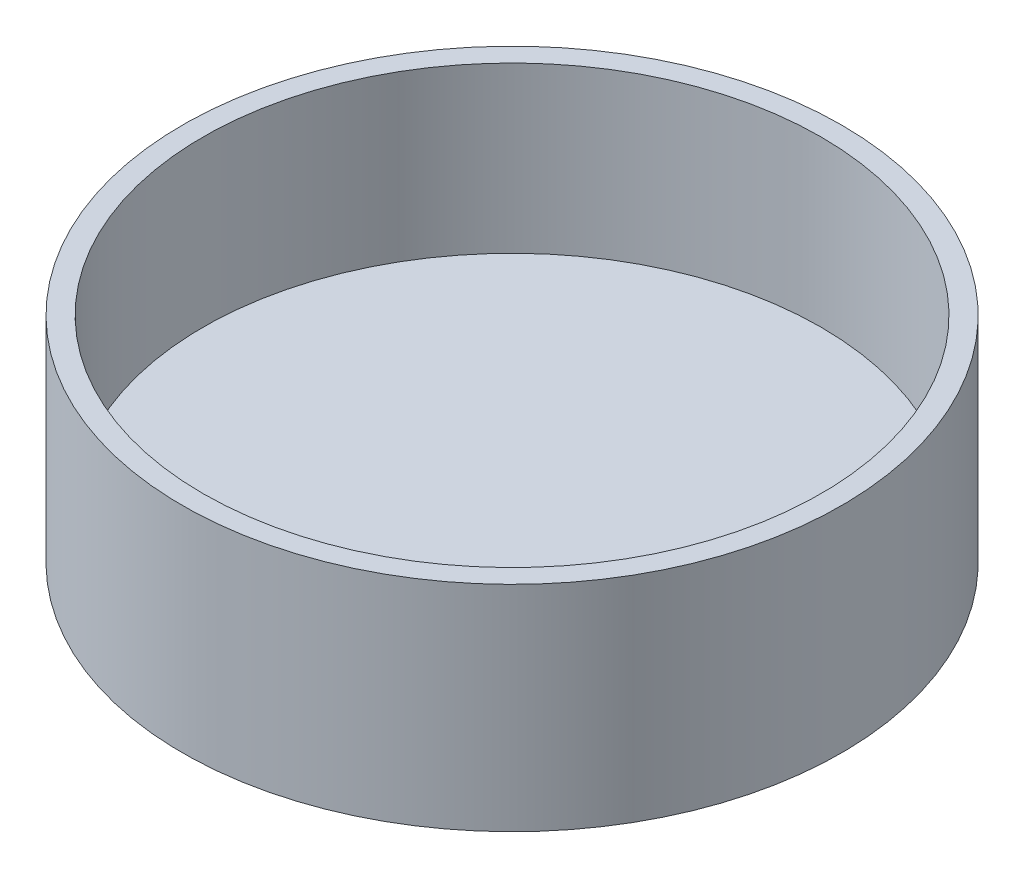
ISO-10303-21;
HEADER;
FILE_DESCRIPTION(('STEP AP214'),'2;1');
FILE_NAME('part.step','',(''),(''),'','','');
FILE_SCHEMA(('AUTOMOTIVE_DESIGN { 1 0 10303 214 1 1 1 1 }'));
ENDSEC;
DATA;
#1=APPLICATION_CONTEXT('core data for automotive mechanical design processes');
#2=APPLICATION_PROTOCOL_DEFINITION('international standard','automotive_design',2000,#1);
#3=PRODUCT_CONTEXT('',#1,'mechanical');
#4=PRODUCT('Part','Part','',(#3));
#5=PRODUCT_RELATED_PRODUCT_CATEGORY('part','',(#4));
#6=PRODUCT_DEFINITION_FORMATION('','',#4);
#7=PRODUCT_DEFINITION_CONTEXT('part definition',#1,'design');
#8=PRODUCT_DEFINITION('design','',#6,#7);
#9=PRODUCT_DEFINITION_SHAPE('','',#8);
#10=(LENGTH_UNIT() NAMED_UNIT(*) SI_UNIT(.MILLI.,.METRE.));
#11=(NAMED_UNIT(*) PLANE_ANGLE_UNIT() SI_UNIT($,.RADIAN.));
#12=(NAMED_UNIT(*) SI_UNIT($,.STERADIAN.) SOLID_ANGLE_UNIT());
#13=UNCERTAINTY_MEASURE_WITH_UNIT(LENGTH_MEASURE(1.E-05),#10,'distance_accuracy_value','');
#14=(GEOMETRIC_REPRESENTATION_CONTEXT(3) GLOBAL_UNCERTAINTY_ASSIGNED_CONTEXT((#13)) GLOBAL_UNIT_ASSIGNED_CONTEXT((#10,
#11,#12)) REPRESENTATION_CONTEXT('',''));
#15=CARTESIAN_POINT('',(0.,0.,0.));
#16=DIRECTION('',(0.,0.,1.));
#17=DIRECTION('',(1.,0.,0.));
#18=AXIS2_PLACEMENT_3D('',#15,#16,#17);
#19=CARTESIAN_POINT('',(0.,52.,0.));
#20=DIRECTION('',(0.,-1.,0.));
#21=DIRECTION('',(0.,0.,-1.));
#22=AXIS2_PLACEMENT_3D('',#19,#20,#21);
#23=CYLINDRICAL_SURFACE('',#22,80.);
#24=CARTESIAN_POINT('',(0.,52.,0.));
#25=DIRECTION('',(0.,1.,0.));
#26=DIRECTION('',(0.,0.,1.));
#27=AXIS2_PLACEMENT_3D('',#24,#25,#26);
#28=CIRCLE('',#27,80.);
#29=CARTESIAN_POINT('',(0.,52.,-80.));
#30=VERTEX_POINT('',#29);
#31=EDGE_CURVE('E12',#30,#30,#28,.T.);
#32=CARTESIAN_POINT('',(0.,0.,0.));
#33=DIRECTION('',(0.,1.,0.));
#34=DIRECTION('',(0.,0.,1.));
#35=AXIS2_PLACEMENT_3D('',#32,#33,#34);
#36=CIRCLE('',#35,80.);
#37=CARTESIAN_POINT('',(0.,0.,-80.));
#38=VERTEX_POINT('',#37);
#39=EDGE_CURVE('E61',#38,#38,#36,.T.);
#40=CARTESIAN_POINT('',(0.,52.,-80.));
#41=CARTESIAN_POINT('',(0.,51.4583333333333,-80.));
#42=CARTESIAN_POINT('',(0.,50.9166666666667,-80.));
#43=CARTESIAN_POINT('',(0.,49.8333333333333,-80.));
#44=CARTESIAN_POINT('',(0.,49.2916666666667,-80.));
#45=CARTESIAN_POINT('',(0.,48.2083333333333,-80.));
#46=CARTESIAN_POINT('',(0.,47.6666666666667,-80.));
#47=CARTESIAN_POINT('',(0.,46.5833333333333,-80.));
#48=CARTESIAN_POINT('',(0.,46.0416666666667,-80.));
#49=CARTESIAN_POINT('',(0.,44.9583333333333,-80.));
#50=CARTESIAN_POINT('',(0.,44.4166666666667,-80.));
#51=CARTESIAN_POINT('',(0.,43.3333333333333,-80.));
#52=CARTESIAN_POINT('',(0.,42.7916666666667,-80.));
#53=CARTESIAN_POINT('',(0.,41.7083333333333,-80.));
#54=CARTESIAN_POINT('',(0.,41.1666666666667,-80.));
#55=CARTESIAN_POINT('',(0.,40.0833333333333,-80.));
#56=CARTESIAN_POINT('',(0.,39.5416666666667,-80.));
#57=CARTESIAN_POINT('',(0.,38.4583333333333,-80.));
#58=CARTESIAN_POINT('',(0.,37.9166666666667,-80.));
#59=CARTESIAN_POINT('',(0.,36.8333333333333,-80.));
#60=CARTESIAN_POINT('',(0.,36.2916666666667,-80.));
#61=CARTESIAN_POINT('',(0.,35.2083333333333,-80.));
#62=CARTESIAN_POINT('',(0.,34.6666666666667,-80.));
#63=CARTESIAN_POINT('',(0.,33.5833333333333,-80.));
#64=CARTESIAN_POINT('',(0.,33.0416666666667,-80.));
#65=CARTESIAN_POINT('',(0.,31.9583333333333,-80.));
#66=CARTESIAN_POINT('',(0.,31.4166666666667,-80.));
#67=CARTESIAN_POINT('',(0.,30.3333333333333,-80.));
#68=CARTESIAN_POINT('',(0.,29.7916666666667,-80.));
#69=CARTESIAN_POINT('',(0.,28.7083333333333,-80.));
#70=CARTESIAN_POINT('',(0.,28.1666666666667,-80.));
#71=CARTESIAN_POINT('',(0.,27.0833333333333,-80.));
#72=CARTESIAN_POINT('',(0.,26.5416666666667,-80.));
#73=CARTESIAN_POINT('',(0.,25.4583333333333,-80.));
#74=CARTESIAN_POINT('',(0.,24.9166666666667,-80.));
#75=CARTESIAN_POINT('',(0.,23.8333333333333,-80.));
#76=CARTESIAN_POINT('',(0.,23.2916666666667,-80.));
#77=CARTESIAN_POINT('',(0.,22.2083333333333,-80.));
#78=CARTESIAN_POINT('',(0.,21.6666666666667,-80.));
#79=CARTESIAN_POINT('',(0.,20.5833333333333,-80.));
#80=CARTESIAN_POINT('',(0.,20.0416666666667,-80.));
#81=CARTESIAN_POINT('',(0.,18.9583333333333,-80.));
#82=CARTESIAN_POINT('',(0.,18.4166666666667,-80.));
#83=CARTESIAN_POINT('',(0.,17.3333333333333,-80.));
#84=CARTESIAN_POINT('',(0.,16.7916666666667,-80.));
#85=CARTESIAN_POINT('',(0.,15.7083333333333,-80.));
#86=CARTESIAN_POINT('',(0.,15.1666666666667,-80.));
#87=CARTESIAN_POINT('',(0.,14.0833333333333,-80.));
#88=CARTESIAN_POINT('',(0.,13.5416666666667,-80.));
#89=CARTESIAN_POINT('',(0.,12.4583333333333,-80.));
#90=CARTESIAN_POINT('',(0.,11.9166666666667,-80.));
#91=CARTESIAN_POINT('',(0.,10.8333333333333,-80.));
#92=CARTESIAN_POINT('',(0.,10.2916666666667,-80.));
#93=CARTESIAN_POINT('',(0.,9.20833333333333,-80.));
#94=CARTESIAN_POINT('',(0.,8.66666666666667,-80.));
#95=CARTESIAN_POINT('',(0.,7.58333333333333,-80.));
#96=CARTESIAN_POINT('',(0.,7.04166666666667,-80.));
#97=CARTESIAN_POINT('',(0.,5.95833333333333,-80.));
#98=CARTESIAN_POINT('',(0.,5.41666666666667,-80.));
#99=CARTESIAN_POINT('',(0.,4.33333333333333,-80.));
#100=CARTESIAN_POINT('',(0.,3.79166666666667,-80.));
#101=CARTESIAN_POINT('',(0.,2.70833333333334,-80.));
#102=CARTESIAN_POINT('',(0.,2.16666666666667,-80.));
#103=CARTESIAN_POINT('',(0.,1.08333333333333,-80.));
#104=CARTESIAN_POINT('',(0.,0.541666666666667,-80.));
#105=CARTESIAN_POINT('',(0.,0.,-80.));
#106=B_SPLINE_CURVE_WITH_KNOTS('',3,(#40,#41,#42,#43,#44,#45,#46,#47,#48,#49,#50,#51,#52,#53,
#54,#55,#56,#57,#58,#59,#60,#61,#62,#63,#64,#65,#66,#67,#68,#69,#70,#71,#72,#73,#74,#75,#76,#77,
#78,#79,#80,#81,#82,#83,#84,#85,#86,#87,#88,#89,#90,#91,#92,#93,#94,#95,#96,#97,#98,#99,#100,
#101,#102,#103,#104,#105),.UNSPECIFIED.,.F.,.F.,(4,2,2,2,2,2,2,2,2,2,2,2,2,2,2,2,2,2,2,2,2,2,2,
2,2,2,2,2,2,2,2,2,4),(0.,1.625,3.25,4.875,6.50000000000001,8.125,9.75,11.375,13.,14.625,16.25,
17.875,19.5,21.125,22.75,24.375,26.,27.625,29.25,30.875,32.5,34.125,35.75,37.375,39.,40.625,
42.25,43.875,45.5,47.125,48.75,50.375,52.),.UNSPECIFIED.);
#107=EDGE_CURVE('BSEAM58',#30,#38,#106,.T.);
#108=ORIENTED_EDGE('',*,*,#31,.F.);
#109=ORIENTED_EDGE('',*,*,#39,.T.);
#110=ORIENTED_EDGE('',*,*,#107,.T.);
#111=ORIENTED_EDGE('',*,*,#107,.F.);
#112=EDGE_LOOP('',(#108,#110,#109,#111));
#113=FACE_BOUND('',#112,.T.);
#114=ADVANCED_FACE('F58',(#113),#23,.T.);
#115=CARTESIAN_POINT('',(0.,52.,0.));
#116=DIRECTION('',(0.,1.,0.));
#117=DIRECTION('',(0.,0.,1.));
#118=AXIS2_PLACEMENT_3D('',#115,#116,#117);
#119=PLANE('',#118);
#120=CARTESIAN_POINT('',(0.,52.,0.));
#121=DIRECTION('',(0.,1.,0.));
#122=DIRECTION('',(0.,0.,1.));
#123=AXIS2_PLACEMENT_3D('',#120,#121,#122);
#124=CIRCLE('',#123,75.);
#125=CARTESIAN_POINT('',(0.,52.,75.));
#126=VERTEX_POINT('',#125);
#127=EDGE_CURVE('E72',#126,#126,#124,.T.);
#128=ORIENTED_EDGE('',*,*,#127,.F.);
#129=EDGE_LOOP('',(#128));
#130=FACE_BOUND('',#129,.T.);
#131=ORIENTED_EDGE('',*,*,#31,.T.);
#132=EDGE_LOOP('',(#131));
#133=FACE_BOUND('',#132,.T.);
#134=ADVANCED_FACE('F89',(#130,#133),#119,.T.);
#135=CARTESIAN_POINT('',(0.,0.,0.));
#136=DIRECTION('',(0.,1.,0.));
#137=DIRECTION('',(0.,0.,1.));
#138=AXIS2_PLACEMENT_3D('',#135,#136,#137);
#139=PLANE('',#138);
#140=ORIENTED_EDGE('',*,*,#39,.F.);
#141=EDGE_LOOP('',(#140));
#142=FACE_BOUND('',#141,.T.);
#143=ADVANCED_FACE('F85',(#142),#139,.F.);
#144=CARTESIAN_POINT('',(0.,12.,0.));
#145=DIRECTION('',(0.,1.,0.));
#146=DIRECTION('',(0.,0.,1.));
#147=AXIS2_PLACEMENT_3D('',#144,#145,#146);
#148=CYLINDRICAL_SURFACE('',#147,75.);
#149=CARTESIAN_POINT('',(0.,12.,0.));
#150=DIRECTION('',(0.,1.,0.));
#151=DIRECTION('',(0.,0.,1.));
#152=AXIS2_PLACEMENT_3D('',#149,#150,#151);
#153=CIRCLE('',#152,75.);
#154=CARTESIAN_POINT('',(0.,12.,75.));
#155=VERTEX_POINT('',#154);
#156=EDGE_CURVE('E70',#155,#155,#153,.T.);
#157=ORIENTED_EDGE('',*,*,#156,.F.);
#158=EDGE_LOOP('',(#157));
#159=FACE_BOUND('',#158,.T.);
#160=ORIENTED_EDGE('',*,*,#127,.T.);
#161=EDGE_LOOP('',(#160));
#162=FACE_BOUND('',#161,.T.);
#163=ADVANCED_FACE('F82',(#159,#162),#148,.F.);
#164=CARTESIAN_POINT('',(0.,12.,0.));
#165=DIRECTION('',(0.,1.,0.));
#166=DIRECTION('',(0.,0.,1.));
#167=AXIS2_PLACEMENT_3D('',#164,#165,#166);
#168=PLANE('',#167);
#169=ORIENTED_EDGE('',*,*,#156,.T.);
#170=EDGE_LOOP('',(#169));
#171=FACE_BOUND('',#170,.T.);
#172=ADVANCED_FACE('F80',(#171),#168,.T.);
#173=CLOSED_SHELL('',(#114,#134,#143,#163,#172));
#174=MANIFOLD_SOLID_BREP('B2',#173);
#175=ADVANCED_BREP_SHAPE_REPRESENTATION('',(#18,#174),#14);
#176=SHAPE_DEFINITION_REPRESENTATION(#9,#175);
ENDSEC;
END-ISO-10303-21;
